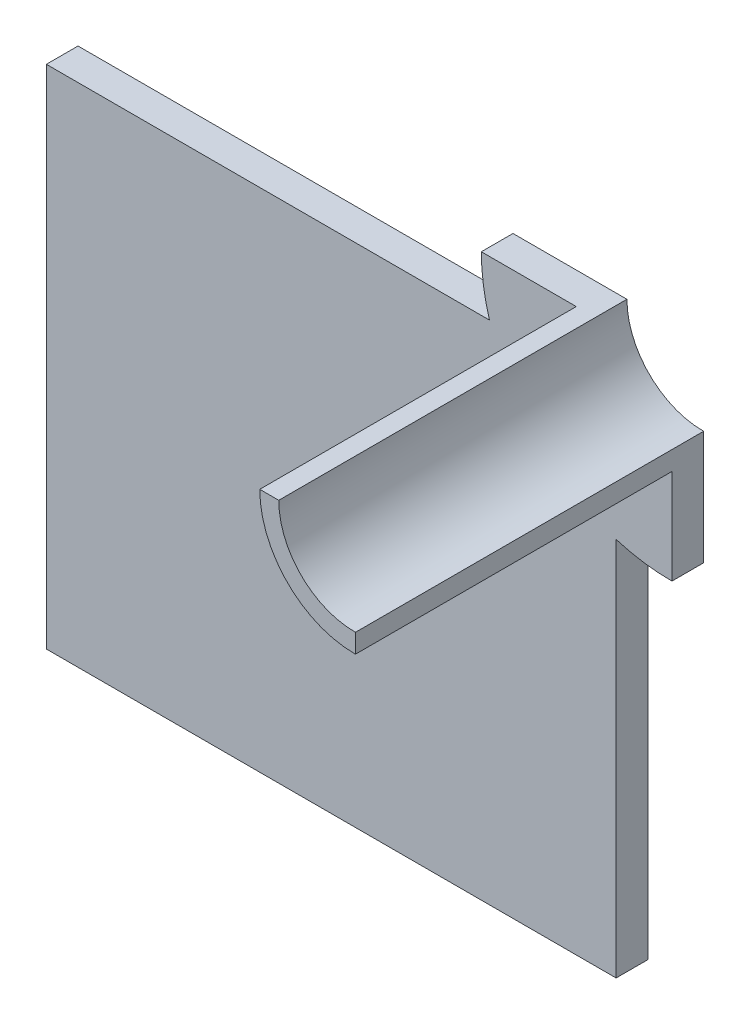
ISO-10303-21;
HEADER;
FILE_DESCRIPTION(('STEP AP214'),'2;1');
FILE_NAME('part.step','',(''),(''),'','','');
FILE_SCHEMA(('AUTOMOTIVE_DESIGN { 1 0 10303 214 1 1 1 1 }'));
ENDSEC;
DATA;
#1=APPLICATION_CONTEXT('core data for automotive mechanical design processes');
#2=APPLICATION_PROTOCOL_DEFINITION('international standard','automotive_design',2000,#1);
#3=PRODUCT_CONTEXT('',#1,'mechanical');
#4=PRODUCT('Part','Part','',(#3));
#5=PRODUCT_RELATED_PRODUCT_CATEGORY('part','',(#4));
#6=PRODUCT_DEFINITION_FORMATION('','',#4);
#7=PRODUCT_DEFINITION_CONTEXT('part definition',#1,'design');
#8=PRODUCT_DEFINITION('design','',#6,#7);
#9=PRODUCT_DEFINITION_SHAPE('','',#8);
#10=(LENGTH_UNIT() NAMED_UNIT(*) SI_UNIT(.MILLI.,.METRE.));
#11=(NAMED_UNIT(*) PLANE_ANGLE_UNIT() SI_UNIT($,.RADIAN.));
#12=(NAMED_UNIT(*) SI_UNIT($,.STERADIAN.) SOLID_ANGLE_UNIT());
#13=UNCERTAINTY_MEASURE_WITH_UNIT(LENGTH_MEASURE(1.E-05),#10,'distance_accuracy_value','');
#14=(GEOMETRIC_REPRESENTATION_CONTEXT(3) GLOBAL_UNCERTAINTY_ASSIGNED_CONTEXT((#13)) GLOBAL_UNIT_ASSIGNED_CONTEXT((#10,
#11,#12)) REPRESENTATION_CONTEXT('',''));
#15=CARTESIAN_POINT('',(0.,0.,0.));
#16=DIRECTION('',(0.,0.,1.));
#17=DIRECTION('',(1.,0.,0.));
#18=AXIS2_PLACEMENT_3D('',#15,#16,#17);
#19=CARTESIAN_POINT('',(0.489750815243,-0.451884831445,0.55));
#20=DIRECTION('',(0.,0.,1.));
#21=DIRECTION('',(1.,0.,0.));
#22=AXIS2_PLACEMENT_3D('',#19,#20,#21);
#23=PLANE('',#22);
#24=CARTESIAN_POINT('',(0.987082869358,0.,0.55));
#25=DIRECTION('',(0.,0.,1.));
#26=DIRECTION('',(1.,0.,0.));
#27=AXIS2_PLACEMENT_3D('',#24,#25,#26);
#28=CIRCLE('',#27,0.15);
#29=CARTESIAN_POINT('',(0.837082869358,0.,0.55));
#30=VERTEX_POINT('',#29);
#31=CARTESIAN_POINT('',(0.988250774,-0.14999545326,0.55));
#32=VERTEX_POINT('',#31);
#33=EDGE_CURVE('E11',#30,#32,#28,.T.);
#34=ORIENTED_EDGE('',*,*,#33,.T.);
#35=DIRECTION('',(0.,1.,0.));
#36=VECTOR('',#35,1.);
#37=CARTESIAN_POINT('',(0.988250774,-0.299997726656,0.55));
#38=LINE('',#37,#36);
#39=CARTESIAN_POINT('',(0.988250774,-0.119994316527,0.55));
#40=VERTEX_POINT('',#39);
#41=EDGE_CURVE('E42',#32,#40,#38,.T.);
#42=ORIENTED_EDGE('',*,*,#41,.T.);
#43=CARTESIAN_POINT('',(0.987082869358,0.,0.55));
#44=DIRECTION('',(0.,0.,1.));
#45=DIRECTION('',(1.,0.,0.));
#46=AXIS2_PLACEMENT_3D('',#43,#44,#45);
#47=CIRCLE('',#46,0.12);
#48=CARTESIAN_POINT('',(0.867082869358,0.,0.55));
#49=VERTEX_POINT('',#48);
#50=EDGE_CURVE('E224',#49,#40,#47,.T.);
#51=ORIENTED_EDGE('',*,*,#50,.F.);
#52=DIRECTION('',(1.,0.,0.));
#53=VECTOR('',#52,1.);
#54=CARTESIAN_POINT('',(0.687082869358,0.,0.55));
#55=LINE('',#54,#53);
#56=EDGE_CURVE('E216',#30,#49,#55,.T.);
#57=ORIENTED_EDGE('',*,*,#56,.F.);
#58=EDGE_LOOP('',(#34,#42,#51,#57));
#59=FACE_BOUND('',#58,.T.);
#60=ADVANCED_FACE('F17',(#59),#23,.T.);
#61=CARTESIAN_POINT('',(0.987082869358,0.,0.55));
#62=DIRECTION('',(0.,0.,1.));
#63=DIRECTION('',(1.,0.,0.));
#64=AXIS2_PLACEMENT_3D('',#61,#62,#63);
#65=CYLINDRICAL_SURFACE('',#64,0.15);
#66=DIRECTION('',(0.,0.,-1.));
#67=VECTOR('',#66,1.);
#68=CARTESIAN_POINT('',(0.837082869358,0.,0.55));
#69=LINE('',#68,#67);
#70=CARTESIAN_POINT('',(0.837082869358,0.,0.05));
#71=VERTEX_POINT('',#70);
#72=EDGE_CURVE('E208',#30,#71,#69,.T.);
#73=ORIENTED_EDGE('',*,*,#72,.T.);
#74=CARTESIAN_POINT('',(0.987082869358,0.,0.05));
#75=DIRECTION('',(0.,0.,1.));
#76=DIRECTION('',(1.,0.,0.));
#77=AXIS2_PLACEMENT_3D('',#74,#75,#76);
#78=CIRCLE('',#77,0.15);
#79=CARTESIAN_POINT('',(0.988250774,-0.14999545326,0.05));
#80=VERTEX_POINT('',#79);
#81=EDGE_CURVE('E205',#71,#80,#78,.T.);
#82=ORIENTED_EDGE('',*,*,#81,.T.);
#83=DIRECTION('',(0.,0.,-1.));
#84=VECTOR('',#83,1.);
#85=CARTESIAN_POINT('',(0.988250774,-0.14999545326,0.55));
#86=LINE('',#85,#84);
#87=EDGE_CURVE('E25',#32,#80,#86,.T.);
#88=ORIENTED_EDGE('',*,*,#87,.F.);
#89=ORIENTED_EDGE('',*,*,#33,.F.);
#90=EDGE_LOOP('',(#73,#82,#88,#89));
#91=FACE_BOUND('',#90,.T.);
#92=ADVANCED_FACE('F258',(#91),#65,.T.);
#93=CARTESIAN_POINT('',(0.988250774,-0.299997726656,0.));
#94=DIRECTION('',(-1.,0.,0.));
#95=DIRECTION('',(0.,0.,1.));
#96=AXIS2_PLACEMENT_3D('',#93,#94,#95);
#97=PLANE('',#96);
#98=DIRECTION('',(0.,1.,0.));
#99=VECTOR('',#98,1.);
#100=CARTESIAN_POINT('',(0.988250774,-0.299997726656,0.));
#101=LINE('',#100,#99);
#102=CARTESIAN_POINT('',(0.988250774,-0.299997726656,0.));
#103=VERTEX_POINT('',#102);
#104=CARTESIAN_POINT('',(0.988250774,-0.119994316527,0.));
#105=VERTEX_POINT('',#104);
#106=EDGE_CURVE('E167',#103,#105,#101,.T.);
#107=ORIENTED_EDGE('',*,*,#106,.T.);
#108=DIRECTION('',(0.,0.,1.));
#109=VECTOR('',#108,1.);
#110=CARTESIAN_POINT('',(0.988250774,-0.119994316527,0.));
#111=LINE('',#110,#109);
#112=EDGE_CURVE('E228',#105,#40,#111,.T.);
#113=ORIENTED_EDGE('',*,*,#112,.T.);
#114=ORIENTED_EDGE('',*,*,#41,.F.);
#115=ORIENTED_EDGE('',*,*,#87,.T.);
#116=DIRECTION('',(0.,1.,0.));
#117=VECTOR('',#116,1.);
#118=CARTESIAN_POINT('',(0.988250774,-0.299997726656,0.05));
#119=LINE('',#118,#117);
#120=CARTESIAN_POINT('',(0.988250774,-0.299997726656,0.05));
#121=VERTEX_POINT('',#120);
#122=EDGE_CURVE('E194',#121,#80,#119,.T.);
#123=ORIENTED_EDGE('',*,*,#122,.F.);
#124=DIRECTION('',(0.,0.,1.));
#125=VECTOR('',#124,1.);
#126=CARTESIAN_POINT('',(0.988250774,-0.299997726656,0.));
#127=LINE('',#126,#125);
#128=EDGE_CURVE('E138',#103,#121,#127,.T.);
#129=ORIENTED_EDGE('',*,*,#128,.F.);
#130=EDGE_LOOP('',(#107,#113,#114,#115,#123,#129));
#131=FACE_BOUND('',#130,.T.);
#132=ADVANCED_FACE('F284',(#131),#97,.F.);
#133=CARTESIAN_POINT('',(0.987082869358,0.,0.));
#134=DIRECTION('',(0.,0.,-1.));
#135=DIRECTION('',(1.,0.,0.));
#136=AXIS2_PLACEMENT_3D('',#133,#134,#135);
#137=CYLINDRICAL_SURFACE('',#136,0.12);
#138=DIRECTION('',(0.,0.,1.));
#139=VECTOR('',#138,1.);
#140=CARTESIAN_POINT('',(0.867082869358,0.,0.));
#141=LINE('',#140,#139);
#142=CARTESIAN_POINT('',(0.867082869358,0.,0.));
#143=VERTEX_POINT('',#142);
#144=EDGE_CURVE('E220',#143,#49,#141,.T.);
#145=ORIENTED_EDGE('',*,*,#144,.T.);
#146=ORIENTED_EDGE('',*,*,#50,.T.);
#147=ORIENTED_EDGE('',*,*,#112,.F.);
#148=CARTESIAN_POINT('',(0.987082869358,0.,0.));
#149=DIRECTION('',(0.,0.,1.));
#150=DIRECTION('',(1.,0.,0.));
#151=AXIS2_PLACEMENT_3D('',#148,#149,#150);
#152=CIRCLE('',#151,0.12);
#153=EDGE_CURVE('E166',#143,#105,#152,.T.);
#154=ORIENTED_EDGE('',*,*,#153,.F.);
#155=EDGE_LOOP('',(#145,#146,#147,#154));
#156=FACE_BOUND('',#155,.T.);
#157=ADVANCED_FACE('F261',(#156),#137,.F.);
#158=CARTESIAN_POINT('',(0.687082869358,0.,0.));
#159=DIRECTION('',(0.,1.,0.));
#160=DIRECTION('',(1.,0.,0.));
#161=AXIS2_PLACEMENT_3D('',#158,#159,#160);
#162=PLANE('',#161);
#163=DIRECTION('',(1.,0.,0.));
#164=VECTOR('',#163,1.);
#165=CARTESIAN_POINT('',(0.687082869358,0.,0.));
#166=LINE('',#165,#164);
#167=CARTESIAN_POINT('',(0.687082869358,0.,0.));
#168=VERTEX_POINT('',#167);
#169=EDGE_CURVE('E162',#168,#143,#166,.T.);
#170=ORIENTED_EDGE('',*,*,#169,.F.);
#171=DIRECTION('',(0.,0.,1.));
#172=VECTOR('',#171,1.);
#173=CARTESIAN_POINT('',(0.687082869358,0.,0.));
#174=LINE('',#173,#172);
#175=CARTESIAN_POINT('',(0.687082869358,0.,0.05));
#176=VERTEX_POINT('',#175);
#177=EDGE_CURVE('E201',#168,#176,#174,.T.);
#178=ORIENTED_EDGE('',*,*,#177,.T.);
#179=DIRECTION('',(1.,0.,0.));
#180=VECTOR('',#179,1.);
#181=CARTESIAN_POINT('',(0.687082869358,0.,0.05));
#182=LINE('',#181,#180);
#183=EDGE_CURVE('E184',#176,#71,#182,.T.);
#184=ORIENTED_EDGE('',*,*,#183,.T.);
#185=ORIENTED_EDGE('',*,*,#72,.F.);
#186=ORIENTED_EDGE('',*,*,#56,.T.);
#187=ORIENTED_EDGE('',*,*,#144,.F.);
#188=EDGE_LOOP('',(#170,#178,#184,#185,#186,#187));
#189=FACE_BOUND('',#188,.T.);
#190=ADVANCED_FACE('F252',(#189),#162,.T.);
#191=CARTESIAN_POINT('',(0.987082869358,0.,0.));
#192=DIRECTION('',(0.,0.,-1.));
#193=DIRECTION('',(1.,0.,0.));
#194=AXIS2_PLACEMENT_3D('',#191,#192,#193);
#195=CYLINDRICAL_SURFACE('',#194,0.3);
#196=CARTESIAN_POINT('',(0.987082869358,0.,0.));
#197=DIRECTION('',(0.,0.,1.));
#198=DIRECTION('',(1.,0.,0.));
#199=AXIS2_PLACEMENT_3D('',#196,#197,#198);
#200=CIRCLE('',#199,0.3);
#201=CARTESIAN_POINT('',(0.700000000017,-0.08708286933189,0.));
#202=VERTEX_POINT('',#201);
#203=EDGE_CURVE('E147',#168,#202,#200,.T.);
#204=ORIENTED_EDGE('',*,*,#203,.T.);
#205=DIRECTION('',(0.,0.,1.));
#206=VECTOR('',#205,1.);
#207=CARTESIAN_POINT('',(0.700000000017,-0.08708286933189,0.));
#208=LINE('',#207,#206);
#209=CARTESIAN_POINT('',(0.699999999540151,-0.0870828689496905,0.05));
#210=VERTEX_POINT('',#209);
#211=EDGE_CURVE('E137',#202,#210,#208,.T.);
#212=ORIENTED_EDGE('',*,*,#211,.T.);
#213=CARTESIAN_POINT('',(0.987082869358,0.,0.05));
#214=DIRECTION('',(0.,0.,1.));
#215=DIRECTION('',(1.,0.,0.));
#216=AXIS2_PLACEMENT_3D('',#213,#214,#215);
#217=CIRCLE('',#216,0.3);
#218=EDGE_CURVE('E185',#176,#210,#217,.T.);
#219=ORIENTED_EDGE('',*,*,#218,.F.);
#220=ORIENTED_EDGE('',*,*,#177,.F.);
#221=EDGE_LOOP('',(#204,#212,#219,#220));
#222=FACE_BOUND('',#221,.T.);
#223=ADVANCED_FACE('F264',(#222),#195,.T.);
#224=CARTESIAN_POINT('',(0.,-0.08708286933441,0.));
#225=DIRECTION('',(0.,1.,0.));
#226=DIRECTION('',(1.,0.,0.));
#227=AXIS2_PLACEMENT_3D('',#224,#225,#226);
#228=PLANE('',#227);
#229=DIRECTION('',(1.,0.,0.));
#230=VECTOR('',#229,1.);
#231=CARTESIAN_POINT('',(0.,-0.08708286933441,0.));
#232=LINE('',#231,#230);
#233=CARTESIAN_POINT('',(0.,-0.08708286933441,0.));
#234=VERTEX_POINT('',#233);
#235=EDGE_CURVE('E141',#234,#202,#232,.T.);
#236=ORIENTED_EDGE('',*,*,#235,.F.);
#237=DIRECTION('',(0.,0.,1.));
#238=VECTOR('',#237,1.);
#239=CARTESIAN_POINT('',(0.,-0.08708286933441,0.));
#240=LINE('',#239,#238);
#241=CARTESIAN_POINT('',(0.,-0.08708286933441,0.05));
#242=VERTEX_POINT('',#241);
#243=EDGE_CURVE('E125',#234,#242,#240,.T.);
#244=ORIENTED_EDGE('',*,*,#243,.T.);
#245=DIRECTION('',(1.,0.,0.));
#246=VECTOR('',#245,1.);
#247=CARTESIAN_POINT('',(0.,-0.08708286933441,0.05));
#248=LINE('',#247,#246);
#249=EDGE_CURVE('E189',#242,#210,#248,.T.);
#250=ORIENTED_EDGE('',*,*,#249,.T.);
#251=ORIENTED_EDGE('',*,*,#211,.F.);
#252=EDGE_LOOP('',(#236,#244,#250,#251));
#253=FACE_BOUND('',#252,.T.);
#254=ADVANCED_FACE('F142',(#253),#228,.T.);
#255=CARTESIAN_POINT('',(0.,-0.887082869334,0.));
#256=DIRECTION('',(-1.,0.,0.));
#257=DIRECTION('',(0.,0.,1.));
#258=AXIS2_PLACEMENT_3D('',#255,#256,#257);
#259=PLANE('',#258);
#260=DIRECTION('',(0.,1.,0.));
#261=VECTOR('',#260,1.);
#262=CARTESIAN_POINT('',(0.,-0.887082869334,0.));
#263=LINE('',#262,#261);
#264=CARTESIAN_POINT('',(0.,-0.887082869334,0.));
#265=VERTEX_POINT('',#264);
#266=EDGE_CURVE('E130',#265,#234,#263,.T.);
#267=ORIENTED_EDGE('',*,*,#266,.F.);
#268=DIRECTION('',(0.,0.,1.));
#269=VECTOR('',#268,1.);
#270=CARTESIAN_POINT('',(0.,-0.887082869334,0.));
#271=LINE('',#270,#269);
#272=CARTESIAN_POINT('',(0.,-0.887082869334,0.05));
#273=VERTEX_POINT('',#272);
#274=EDGE_CURVE('E181',#265,#273,#271,.T.);
#275=ORIENTED_EDGE('',*,*,#274,.T.);
#276=DIRECTION('',(0.,-1.,0.));
#277=VECTOR('',#276,1.);
#278=CARTESIAN_POINT('',(0.,-0.08708286933441,0.05));
#279=LINE('',#278,#277);
#280=EDGE_CURVE('E132',#242,#273,#279,.T.);
#281=ORIENTED_EDGE('',*,*,#280,.F.);
#282=ORIENTED_EDGE('',*,*,#243,.F.);
#283=EDGE_LOOP('',(#267,#275,#281,#282));
#284=FACE_BOUND('',#283,.T.);
#285=ADVANCED_FACE('F127',(#284),#259,.T.);
#286=CARTESIAN_POINT('',(0.987082869358,0.,0.));
#287=DIRECTION('',(0.,0.,-1.));
#288=DIRECTION('',(1.,0.,0.));
#289=AXIS2_PLACEMENT_3D('',#286,#287,#288);
#290=CYLINDRICAL_SURFACE('',#289,0.3);
#291=CARTESIAN_POINT('',(0.987082869358,0.,0.));
#292=DIRECTION('',(0.,0.,1.));
#293=DIRECTION('',(1.,0.,0.));
#294=AXIS2_PLACEMENT_3D('',#291,#292,#293);
#295=CIRCLE('',#294,0.3);
#296=CARTESIAN_POINT('',(0.9,-0.287082869333,0.));
#297=VERTEX_POINT('',#296);
#298=EDGE_CURVE('E171',#297,#103,#295,.T.);
#299=ORIENTED_EDGE('',*,*,#298,.T.);
#300=ORIENTED_EDGE('',*,*,#128,.T.);
#301=CARTESIAN_POINT('',(0.987082869358,0.,0.05));
#302=DIRECTION('',(0.,0.,1.));
#303=DIRECTION('',(1.,0.,0.));
#304=AXIS2_PLACEMENT_3D('',#301,#302,#303);
#305=CIRCLE('',#304,0.3);
#306=CARTESIAN_POINT('',(0.9,-0.287082869333,0.05));
#307=VERTEX_POINT('',#306);
#308=EDGE_CURVE('E190',#307,#121,#305,.T.);
#309=ORIENTED_EDGE('',*,*,#308,.F.);
#310=DIRECTION('',(0.,0.,1.));
#311=VECTOR('',#310,1.);
#312=CARTESIAN_POINT('',(0.9,-0.287082869333,0.));
#313=LINE('',#312,#311);
#314=EDGE_CURVE('E241',#297,#307,#313,.T.);
#315=ORIENTED_EDGE('',*,*,#314,.F.);
#316=EDGE_LOOP('',(#299,#300,#309,#315));
#317=FACE_BOUND('',#316,.T.);
#318=ADVANCED_FACE('F283',(#317),#290,.T.);
#319=CARTESIAN_POINT('',(0.486927824404,-0.454543268512,0.05));
#320=DIRECTION('',(0.,0.,1.));
#321=DIRECTION('',(1.,0.,0.));
#322=AXIS2_PLACEMENT_3D('',#319,#320,#321);
#323=PLANE('',#322);
#324=ORIENTED_EDGE('',*,*,#183,.F.);
#325=ORIENTED_EDGE('',*,*,#218,.T.);
#326=ORIENTED_EDGE('',*,*,#249,.F.);
#327=ORIENTED_EDGE('',*,*,#280,.T.);
#328=DIRECTION('',(1.,0.,0.));
#329=VECTOR('',#328,1.);
#330=CARTESIAN_POINT('',(0.,-0.887082869334,0.05));
#331=LINE('',#330,#329);
#332=CARTESIAN_POINT('',(0.9,-0.887082869334,0.05));
#333=VERTEX_POINT('',#332);
#334=EDGE_CURVE('E178',#273,#333,#331,.T.);
#335=ORIENTED_EDGE('',*,*,#334,.T.);
#336=DIRECTION('',(0.,1.,0.));
#337=VECTOR('',#336,1.);
#338=CARTESIAN_POINT('',(0.9,-0.887082869334,0.05));
#339=LINE('',#338,#337);
#340=EDGE_CURVE('E244',#333,#307,#339,.T.);
#341=ORIENTED_EDGE('',*,*,#340,.T.);
#342=ORIENTED_EDGE('',*,*,#308,.T.);
#343=ORIENTED_EDGE('',*,*,#122,.T.);
#344=ORIENTED_EDGE('',*,*,#81,.F.);
#345=EDGE_LOOP('',(#324,#325,#326,#327,#335,#341,#342,#343,#344));
#346=FACE_BOUND('',#345,.T.);
#347=ADVANCED_FACE('F256',(#346),#323,.T.);
#348=CARTESIAN_POINT('',(0.9,-0.887082869334,0.));
#349=DIRECTION('',(0.,-1.,0.));
#350=DIRECTION('',(0.,0.,-1.));
#351=AXIS2_PLACEMENT_3D('',#348,#349,#350);
#352=PLANE('',#351);
#353=DIRECTION('',(-1.,0.,0.));
#354=VECTOR('',#353,1.);
#355=CARTESIAN_POINT('',(0.9,-0.887082869334,0.));
#356=LINE('',#355,#354);
#357=CARTESIAN_POINT('',(0.9,-0.887082869334,0.));
#358=VERTEX_POINT('',#357);
#359=EDGE_CURVE('E151',#358,#265,#356,.T.);
#360=ORIENTED_EDGE('',*,*,#359,.F.);
#361=DIRECTION('',(0.,0.,1.));
#362=VECTOR('',#361,1.);
#363=CARTESIAN_POINT('',(0.9,-0.887082869334,0.));
#364=LINE('',#363,#362);
#365=EDGE_CURVE('E157',#358,#333,#364,.T.);
#366=ORIENTED_EDGE('',*,*,#365,.T.);
#367=ORIENTED_EDGE('',*,*,#334,.F.);
#368=ORIENTED_EDGE('',*,*,#274,.F.);
#369=EDGE_LOOP('',(#360,#366,#367,#368));
#370=FACE_BOUND('',#369,.T.);
#371=ADVANCED_FACE('F268',(#370),#352,.T.);
#372=CARTESIAN_POINT('',(0.489750815243,-0.451884831445,0.));
#373=DIRECTION('',(0.,0.,1.));
#374=DIRECTION('',(1.,0.,0.));
#375=AXIS2_PLACEMENT_3D('',#372,#373,#374);
#376=PLANE('',#375);
#377=DIRECTION('',(0.,-1.,0.));
#378=VECTOR('',#377,1.);
#379=CARTESIAN_POINT('',(0.9,-0.287082869333,0.));
#380=LINE('',#379,#378);
#381=EDGE_CURVE('E279',#297,#358,#380,.T.);
#382=ORIENTED_EDGE('',*,*,#381,.T.);
#383=ORIENTED_EDGE('',*,*,#359,.T.);
#384=ORIENTED_EDGE('',*,*,#266,.T.);
#385=ORIENTED_EDGE('',*,*,#235,.T.);
#386=ORIENTED_EDGE('',*,*,#203,.F.);
#387=ORIENTED_EDGE('',*,*,#169,.T.);
#388=ORIENTED_EDGE('',*,*,#153,.T.);
#389=ORIENTED_EDGE('',*,*,#106,.F.);
#390=ORIENTED_EDGE('',*,*,#298,.F.);
#391=EDGE_LOOP('',(#382,#383,#384,#385,#386,#387,#388,#389,#390));
#392=FACE_BOUND('',#391,.T.);
#393=ADVANCED_FACE('F150',(#392),#376,.F.);
#394=CARTESIAN_POINT('',(0.9,-0.287082869333,0.));
#395=DIRECTION('',(1.,0.,0.));
#396=DIRECTION('',(0.,1.,0.));
#397=AXIS2_PLACEMENT_3D('',#394,#395,#396);
#398=PLANE('',#397);
#399=ORIENTED_EDGE('',*,*,#381,.F.);
#400=ORIENTED_EDGE('',*,*,#314,.T.);
#401=ORIENTED_EDGE('',*,*,#340,.F.);
#402=ORIENTED_EDGE('',*,*,#365,.F.);
#403=EDGE_LOOP('',(#399,#400,#401,#402));
#404=FACE_BOUND('',#403,.T.);
#405=ADVANCED_FACE('F274',(#404),#398,.T.);
#406=CLOSED_SHELL('',(#60,#92,#132,#157,#190,#223,#254,#285,#318,#347,#371,#393,#405));
#407=MANIFOLD_SOLID_BREP('B1',#406);
#408=ADVANCED_BREP_SHAPE_REPRESENTATION('',(#18,#407),#14);
#409=SHAPE_DEFINITION_REPRESENTATION(#9,#408);
ENDSEC;
END-ISO-10303-21;
